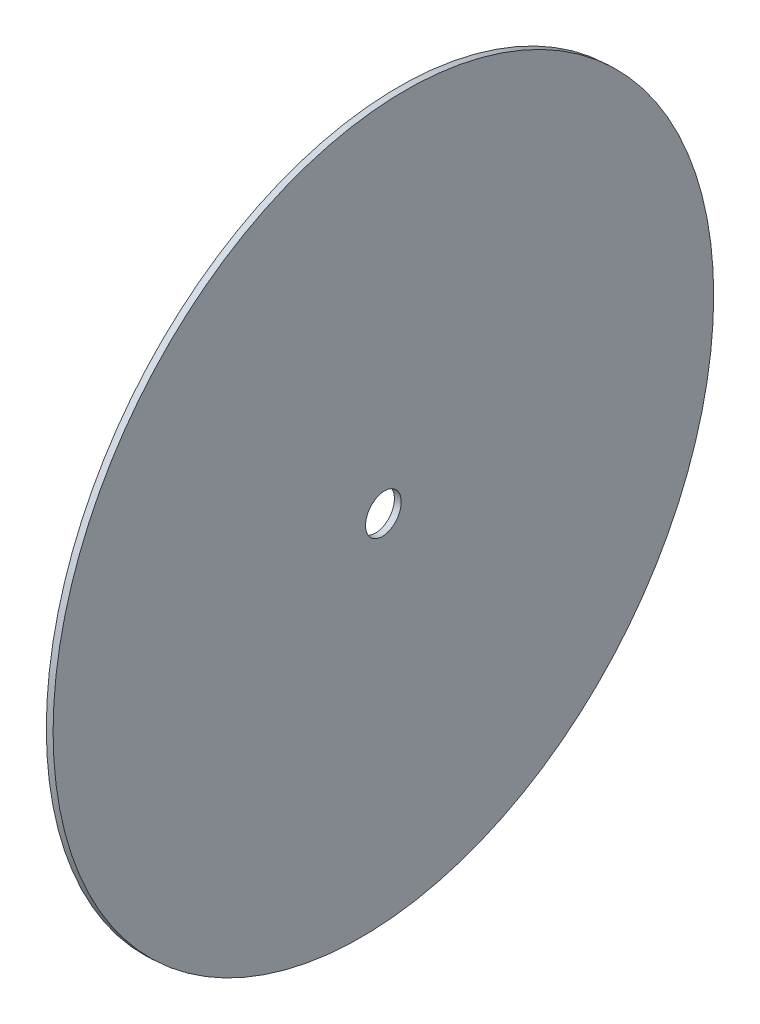
ISO-10303-21;
HEADER;
FILE_DESCRIPTION(('STEP AP214'),'2;1');
FILE_NAME('part.step','',(''),(''),'','','');
FILE_SCHEMA(('AUTOMOTIVE_DESIGN { 1 0 10303 214 1 1 1 1 }'));
ENDSEC;
DATA;
#1=APPLICATION_CONTEXT('core data for automotive mechanical design processes');
#2=APPLICATION_PROTOCOL_DEFINITION('international standard','automotive_design',2000,#1);
#3=PRODUCT_CONTEXT('',#1,'mechanical');
#4=PRODUCT('Part','Part','',(#3));
#5=PRODUCT_RELATED_PRODUCT_CATEGORY('part','',(#4));
#6=PRODUCT_DEFINITION_FORMATION('','',#4);
#7=PRODUCT_DEFINITION_CONTEXT('part definition',#1,'design');
#8=PRODUCT_DEFINITION('design','',#6,#7);
#9=PRODUCT_DEFINITION_SHAPE('','',#8);
#10=(LENGTH_UNIT() NAMED_UNIT(*) SI_UNIT(.MILLI.,.METRE.));
#11=(NAMED_UNIT(*) PLANE_ANGLE_UNIT() SI_UNIT($,.RADIAN.));
#12=(NAMED_UNIT(*) SI_UNIT($,.STERADIAN.) SOLID_ANGLE_UNIT());
#13=UNCERTAINTY_MEASURE_WITH_UNIT(LENGTH_MEASURE(1.E-05),#10,'distance_accuracy_value','');
#14=(GEOMETRIC_REPRESENTATION_CONTEXT(3) GLOBAL_UNCERTAINTY_ASSIGNED_CONTEXT((#13)) GLOBAL_UNIT_ASSIGNED_CONTEXT((#10,
#11,#12)) REPRESENTATION_CONTEXT('',''));
#15=CARTESIAN_POINT('',(0.,0.,0.));
#16=DIRECTION('',(0.,0.,1.));
#17=DIRECTION('',(1.,0.,0.));
#18=AXIS2_PLACEMENT_3D('',#15,#16,#17);
#19=CARTESIAN_POINT('',(76.7327144454954,72.3954387510351,180.020720032715));
#20=DIRECTION('',(-0.997743585907907,0.,0.0671396811105779));
#21=DIRECTION('',(0.0671396811105779,0.,0.997743585907907));
#22=AXIS2_PLACEMENT_3D('',#19,#20,#21);
#23=CYLINDRICAL_SURFACE('',#22,44.5);
#24=CARTESIAN_POINT('',(76.7363124978633,72.3954387510351,180.020477914307));
#25=DIRECTION('',(-0.997743585907907,0.,0.0671396811105779));
#26=DIRECTION('',(0.0671396811105779,0.,0.997743585907907));
#27=AXIS2_PLACEMENT_3D('',#24,#25,#26);
#28=CIRCLE('',#27,44.5);
#29=CARTESIAN_POINT('',(79.724028307284,72.3954387510351,224.420067487209));
#30=VERTEX_POINT('',#29);
#31=EDGE_CURVE('E10',#30,#30,#28,.T.);
#32=ORIENTED_EDGE('',*,*,#31,.T.);
#33=EDGE_LOOP('',(#32));
#34=FACE_BOUND('',#33,.T.);
#35=CARTESIAN_POINT('',(75.9381176291369,72.3954387510351,180.074189659195));
#36=DIRECTION('',(-0.997743585907907,0.,0.0671396811105779));
#37=DIRECTION('',(0.0671396811105779,0.,0.997743585907907));
#38=AXIS2_PLACEMENT_3D('',#35,#36,#37);
#39=CIRCLE('',#38,44.5);
#40=CARTESIAN_POINT('',(78.9258334385576,72.3954387510351,224.473779232097));
#41=VERTEX_POINT('',#40);
#42=EDGE_CURVE('E42',#41,#41,#39,.T.);
#43=ORIENTED_EDGE('',*,*,#42,.F.);
#44=EDGE_LOOP('',(#43));
#45=FACE_BOUND('',#44,.T.);
#46=ADVANCED_FACE('F28',(#34,#45),#23,.T.);
#47=CARTESIAN_POINT('',(79.7240283072836,72.3954387510351,224.420067487209));
#48=DIRECTION('',(0.997743585907907,0.,-0.0671396811105779));
#49=DIRECTION('',(-0.0671396811105779,0.,-0.997743585907907));
#50=AXIS2_PLACEMENT_3D('',#47,#48,#49);
#51=PLANE('',#50);
#52=CARTESIAN_POINT('',(76.7363124978626,72.3954387510351,180.020477914307));
#53=DIRECTION('',(-0.997743585907907,0.,0.0671396811105779));
#54=DIRECTION('',(0.0671396811105779,0.,0.997743585907907));
#55=AXIS2_PLACEMENT_3D('',#52,#53,#54);
#56=CIRCLE('',#55,2.4);
#57=CARTESIAN_POINT('',(76.897447732528,72.3954387510351,182.415062520486));
#58=VERTEX_POINT('',#57);
#59=EDGE_CURVE('E34',#58,#58,#56,.T.);
#60=ORIENTED_EDGE('',*,*,#59,.T.);
#61=EDGE_LOOP('',(#60));
#62=FACE_BOUND('',#61,.T.);
#63=ORIENTED_EDGE('',*,*,#31,.F.);
#64=EDGE_LOOP('',(#63));
#65=FACE_BOUND('',#64,.T.);
#66=ADVANCED_FACE('F52',(#62,#65),#51,.T.);
#67=CARTESIAN_POINT('',(76.7327144454954,72.3954387510351,180.020720032715));
#68=DIRECTION('',(-0.997743585907907,0.,0.0671396811105779));
#69=DIRECTION('',(0.0671396811105779,0.,0.997743585907907));
#70=AXIS2_PLACEMENT_3D('',#67,#68,#69);
#71=CYLINDRICAL_SURFACE('',#70,2.40000000000001);
#72=CARTESIAN_POINT('',(75.9381176291363,72.3954387510351,180.074189659195));
#73=DIRECTION('',(-0.997743585907907,0.,0.0671396811105779));
#74=DIRECTION('',(0.0671396811105779,0.,0.997743585907907));
#75=AXIS2_PLACEMENT_3D('',#72,#73,#74);
#76=CIRCLE('',#75,2.40000000000001);
#77=CARTESIAN_POINT('',(76.0992528638017,72.3954387510351,182.468774265374));
#78=VERTEX_POINT('',#77);
#79=EDGE_CURVE('E38',#78,#78,#76,.T.);
#80=ORIENTED_EDGE('',*,*,#79,.T.);
#81=EDGE_LOOP('',(#80));
#82=FACE_BOUND('',#81,.T.);
#83=ORIENTED_EDGE('',*,*,#59,.F.);
#84=EDGE_LOOP('',(#83));
#85=FACE_BOUND('',#84,.T.);
#86=ADVANCED_FACE('F56',(#82,#85),#71,.F.);
#87=CARTESIAN_POINT('',(76.099252863802,72.3954387510351,182.468774265374));
#88=DIRECTION('',(-0.997743585907907,0.,0.0671396811105779));
#89=DIRECTION('',(0.0671396811105779,0.,0.997743585907907));
#90=AXIS2_PLACEMENT_3D('',#87,#88,#89);
#91=PLANE('',#90);
#92=ORIENTED_EDGE('',*,*,#42,.T.);
#93=EDGE_LOOP('',(#92));
#94=FACE_BOUND('',#93,.T.);
#95=ORIENTED_EDGE('',*,*,#79,.F.);
#96=EDGE_LOOP('',(#95));
#97=FACE_BOUND('',#96,.T.);
#98=ADVANCED_FACE('F48',(#94,#97),#91,.T.);
#99=CLOSED_SHELL('',(#46,#66,#86,#98));
#100=MANIFOLD_SOLID_BREP('B2',#99);
#101=ADVANCED_BREP_SHAPE_REPRESENTATION('',(#18,#100),#14);
#102=SHAPE_DEFINITION_REPRESENTATION(#9,#101);
ENDSEC;
END-ISO-10303-21;
